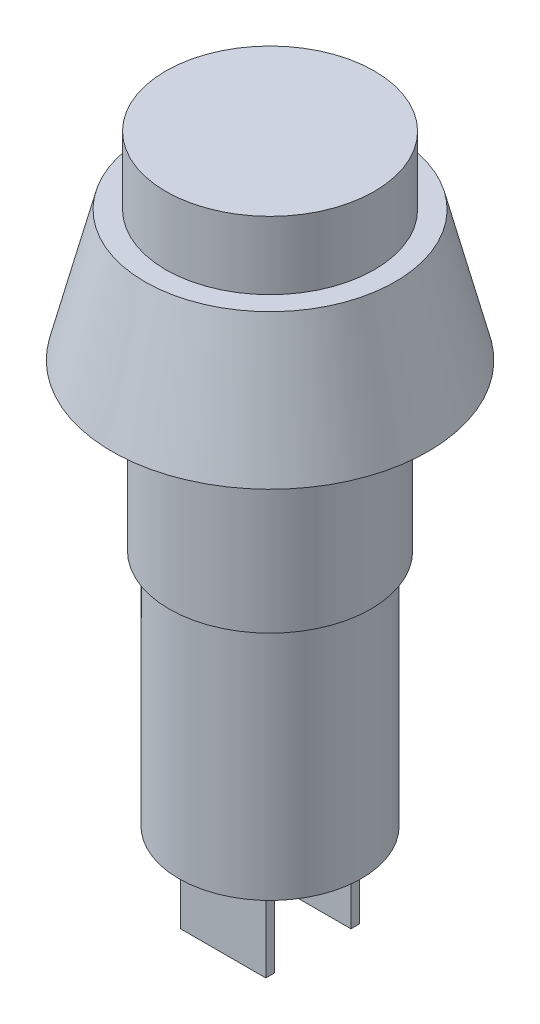
ISO-10303-21;
HEADER;
FILE_DESCRIPTION(('STEP AP214'),'2;1');
FILE_NAME('part.step','',(''),(''),'','','');
FILE_SCHEMA(('AUTOMOTIVE_DESIGN { 1 0 10303 214 1 1 1 1 }'));
ENDSEC;
DATA;
#1=APPLICATION_CONTEXT('core data for automotive mechanical design processes');
#2=APPLICATION_PROTOCOL_DEFINITION('international standard','automotive_design',2000,#1);
#3=PRODUCT_CONTEXT('',#1,'mechanical');
#4=PRODUCT('Part','Part','',(#3));
#5=PRODUCT_RELATED_PRODUCT_CATEGORY('part','',(#4));
#6=PRODUCT_DEFINITION_FORMATION('','',#4);
#7=PRODUCT_DEFINITION_CONTEXT('part definition',#1,'design');
#8=PRODUCT_DEFINITION('design','',#6,#7);
#9=PRODUCT_DEFINITION_SHAPE('','',#8);
#10=(LENGTH_UNIT() NAMED_UNIT(*) SI_UNIT(.MILLI.,.METRE.));
#11=(NAMED_UNIT(*) PLANE_ANGLE_UNIT() SI_UNIT($,.RADIAN.));
#12=(NAMED_UNIT(*) SI_UNIT($,.STERADIAN.) SOLID_ANGLE_UNIT());
#13=UNCERTAINTY_MEASURE_WITH_UNIT(LENGTH_MEASURE(1.E-05),#10,'distance_accuracy_value','');
#14=(GEOMETRIC_REPRESENTATION_CONTEXT(3) GLOBAL_UNCERTAINTY_ASSIGNED_CONTEXT((#13)) GLOBAL_UNIT_ASSIGNED_CONTEXT((#10,
#11,#12)) REPRESENTATION_CONTEXT('',''));
#15=CARTESIAN_POINT('',(0.,0.,0.));
#16=DIRECTION('',(0.,0.,1.));
#17=DIRECTION('',(1.,0.,0.));
#18=AXIS2_PLACEMENT_3D('',#15,#16,#17);
#19=CARTESIAN_POINT('',(0.,-23.2,0.));
#20=DIRECTION('',(0.,-1.,0.));
#21=DIRECTION('',(0.,0.,-1.));
#22=AXIS2_PLACEMENT_3D('',#19,#20,#21);
#23=PLANE('',#22);
#24=CARTESIAN_POINT('',(0.,-23.2,0.));
#25=DIRECTION('',(0.,-1.,0.));
#26=DIRECTION('',(0.,0.,-1.));
#27=AXIS2_PLACEMENT_3D('',#24,#25,#26);
#28=CIRCLE('',#27,5.25);
#29=CARTESIAN_POINT('',(0.,-23.2,5.25));
#30=VERTEX_POINT('',#29);
#31=EDGE_CURVE('E159',#30,#30,#28,.T.);
#32=ORIENTED_EDGE('',*,*,#31,.T.);
#33=EDGE_LOOP('',(#32));
#34=FACE_BOUND('',#33,.T.);
#35=DIRECTION('',(-1.,0.,0.));
#36=VECTOR('',#35,1.);
#37=CARTESIAN_POINT('',(-2.44888346902528,-23.2,-2.2));
#38=LINE('',#37,#36);
#39=CARTESIAN_POINT('',(2.44972941126065,-23.2,-2.2));
#40=VERTEX_POINT('',#39);
#41=CARTESIAN_POINT('',(-2.44888346902528,-23.2,-2.2));
#42=VERTEX_POINT('',#41);
#43=EDGE_CURVE('E130',#40,#42,#38,.T.);
#44=ORIENTED_EDGE('',*,*,#43,.F.);
#45=DIRECTION('',(0.,0.,1.));
#46=VECTOR('',#45,1.);
#47=CARTESIAN_POINT('',(2.44972941126065,-23.2,-2.2));
#48=LINE('',#47,#46);
#49=CARTESIAN_POINT('',(2.44972941126065,-23.2,-2.70037689957547));
#50=VERTEX_POINT('',#49);
#51=EDGE_CURVE('E127',#50,#40,#48,.T.);
#52=ORIENTED_EDGE('',*,*,#51,.F.);
#53=DIRECTION('',(1.,0.,0.));
#54=VECTOR('',#53,1.);
#55=CARTESIAN_POINT('',(-2.44888346902528,-23.2,-2.70037689957547));
#56=LINE('',#55,#54);
#57=CARTESIAN_POINT('',(-2.44888346902528,-23.2,-2.70037689957547));
#58=VERTEX_POINT('',#57);
#59=EDGE_CURVE('E139',#58,#50,#56,.T.);
#60=ORIENTED_EDGE('',*,*,#59,.F.);
#61=DIRECTION('',(0.,0.,-1.));
#62=VECTOR('',#61,1.);
#63=CARTESIAN_POINT('',(-2.44888346902528,-23.2,-2.2));
#64=LINE('',#63,#62);
#65=EDGE_CURVE('E147',#42,#58,#64,.T.);
#66=ORIENTED_EDGE('',*,*,#65,.F.);
#67=EDGE_LOOP('',(#44,#52,#60,#66));
#68=FACE_BOUND('',#67,.T.);
#69=DIRECTION('',(-1.,0.,0.));
#70=VECTOR('',#69,1.);
#71=CARTESIAN_POINT('',(-2.44888346902528,-23.2,2.69560741262609));
#72=LINE('',#71,#70);
#73=CARTESIAN_POINT('',(2.44972941126065,-23.2,2.69560741262609));
#74=VERTEX_POINT('',#73);
#75=CARTESIAN_POINT('',(-2.44888346902528,-23.2,2.69560741262609));
#76=VERTEX_POINT('',#75);
#77=EDGE_CURVE('E373',#74,#76,#72,.T.);
#78=ORIENTED_EDGE('',*,*,#77,.F.);
#79=DIRECTION('',(0.,0.,1.));
#80=VECTOR('',#79,1.);
#81=CARTESIAN_POINT('',(2.44972941126065,-23.2,2.2));
#82=LINE('',#81,#80);
#83=CARTESIAN_POINT('',(2.44972941126065,-23.2,2.2));
#84=VERTEX_POINT('',#83);
#85=EDGE_CURVE('E125',#84,#74,#82,.T.);
#86=ORIENTED_EDGE('',*,*,#85,.F.);
#87=DIRECTION('',(1.,0.,0.));
#88=VECTOR('',#87,1.);
#89=CARTESIAN_POINT('',(-2.44888346902528,-23.2,2.2));
#90=LINE('',#89,#88);
#91=CARTESIAN_POINT('',(-2.44888346902528,-23.2,2.2));
#92=VERTEX_POINT('',#91);
#93=EDGE_CURVE('E121',#92,#84,#90,.T.);
#94=ORIENTED_EDGE('',*,*,#93,.F.);
#95=DIRECTION('',(0.,0.,-1.));
#96=VECTOR('',#95,1.);
#97=CARTESIAN_POINT('',(-2.44888346902528,-23.2,2.2));
#98=LINE('',#97,#96);
#99=EDGE_CURVE('E370',#76,#92,#98,.T.);
#100=ORIENTED_EDGE('',*,*,#99,.F.);
#101=EDGE_LOOP('',(#78,#86,#94,#100));
#102=FACE_BOUND('',#101,.T.);
#103=ADVANCED_FACE('F36',(#34,#68,#102),#23,.T.);
#104=CARTESIAN_POINT('',(-9.1,0.,0.));
#105=DIRECTION('',(0.,1.,0.));
#106=DIRECTION('',(0.,0.,1.));
#107=AXIS2_PLACEMENT_3D('',#104,#105,#106);
#108=PLANE('',#107);
#109=CARTESIAN_POINT('',(0.,0.,0.));
#110=DIRECTION('',(0.,1.,0.));
#111=DIRECTION('',(0.,0.,1.));
#112=AXIS2_PLACEMENT_3D('',#109,#110,#111);
#113=CIRCLE('',#112,5.8);
#114=CARTESIAN_POINT('',(0.,0.,5.8));
#115=VERTEX_POINT('',#114);
#116=EDGE_CURVE('E11',#115,#115,#113,.F.);
#117=ORIENTED_EDGE('',*,*,#116,.F.);
#118=EDGE_LOOP('',(#117));
#119=FACE_BOUND('',#118,.T.);
#120=CARTESIAN_POINT('',(0.,0.,0.));
#121=DIRECTION('',(0.,-1.,0.));
#122=DIRECTION('',(0.,0.,-1.));
#123=AXIS2_PLACEMENT_3D('',#120,#121,#122);
#124=CIRCLE('',#123,9.1);
#125=CARTESIAN_POINT('',(0.,0.,-9.1));
#126=VERTEX_POINT('',#125);
#127=EDGE_CURVE('E170',#126,#126,#124,.T.);
#128=ORIENTED_EDGE('',*,*,#127,.T.);
#129=EDGE_LOOP('',(#128));
#130=FACE_BOUND('',#129,.T.);
#131=ADVANCED_FACE('F38',(#119,#130),#108,.F.);
#132=CARTESIAN_POINT('',(0.,7.5,0.));
#133=DIRECTION('',(0.,-1.,0.));
#134=DIRECTION('',(0.,0.,-1.));
#135=AXIS2_PLACEMENT_3D('',#132,#133,#134);
#136=PLANE('',#135);
#137=CARTESIAN_POINT('',(0.,7.5,0.));
#138=DIRECTION('',(0.,-1.,0.));
#139=DIRECTION('',(0.,0.,-1.));
#140=AXIS2_PLACEMENT_3D('',#137,#138,#139);
#141=CIRCLE('',#140,6.);
#142=CARTESIAN_POINT('',(0.,7.5,-6.));
#143=VERTEX_POINT('',#142);
#144=EDGE_CURVE('E44',#143,#143,#141,.F.);
#145=ORIENTED_EDGE('',*,*,#144,.F.);
#146=EDGE_LOOP('',(#145));
#147=FACE_BOUND('',#146,.T.);
#148=CARTESIAN_POINT('',(0.,7.5,0.));
#149=DIRECTION('',(0.,-1.,0.));
#150=DIRECTION('',(0.,0.,-1.));
#151=AXIS2_PLACEMENT_3D('',#148,#149,#150);
#152=CIRCLE('',#151,7.2);
#153=CARTESIAN_POINT('',(0.,7.5,-7.2));
#154=VERTEX_POINT('',#153);
#155=EDGE_CURVE('E173',#154,#154,#152,.T.);
#156=ORIENTED_EDGE('',*,*,#155,.F.);
#157=EDGE_LOOP('',(#156));
#158=FACE_BOUND('',#157,.T.);
#159=ADVANCED_FACE('F180',(#147,#158),#136,.F.);
#160=CARTESIAN_POINT('',(0.,7.5,0.));
#161=DIRECTION('',(0.,-1.,0.));
#162=DIRECTION('',(0.,0.,-1.));
#163=AXIS2_PLACEMENT_3D('',#160,#161,#162);
#164=CONICAL_SURFACE('',#163,7.2,0.248113449096677);
#165=ORIENTED_EDGE('',*,*,#127,.F.);
#166=EDGE_LOOP('',(#165));
#167=FACE_BOUND('',#166,.T.);
#168=ORIENTED_EDGE('',*,*,#155,.T.);
#169=EDGE_LOOP('',(#168));
#170=FACE_BOUND('',#169,.T.);
#171=ADVANCED_FACE('F183',(#167,#170),#164,.T.);
#172=CARTESIAN_POINT('',(0.,11.4,0.));
#173=DIRECTION('',(0.,-1.,0.));
#174=DIRECTION('',(0.,0.,-1.));
#175=AXIS2_PLACEMENT_3D('',#172,#173,#174);
#176=CYLINDRICAL_SURFACE('',#175,6.);
#177=CARTESIAN_POINT('',(0.,11.4,0.));
#178=DIRECTION('',(0.,1.,0.));
#179=DIRECTION('',(0.,0.,1.));
#180=AXIS2_PLACEMENT_3D('',#177,#178,#179);
#181=CIRCLE('',#180,6.);
#182=CARTESIAN_POINT('',(0.,11.4,6.));
#183=VERTEX_POINT('',#182);
#184=EDGE_CURVE('E167',#183,#183,#181,.T.);
#185=ORIENTED_EDGE('',*,*,#184,.F.);
#186=EDGE_LOOP('',(#185));
#187=FACE_BOUND('',#186,.T.);
#188=ORIENTED_EDGE('',*,*,#144,.T.);
#189=EDGE_LOOP('',(#188));
#190=FACE_BOUND('',#189,.T.);
#191=ADVANCED_FACE('F178',(#187,#190),#176,.T.);
#192=CARTESIAN_POINT('',(0.,11.4,0.));
#193=DIRECTION('',(0.,1.,0.));
#194=DIRECTION('',(0.,0.,1.));
#195=AXIS2_PLACEMENT_3D('',#192,#193,#194);
#196=PLANE('',#195);
#197=ORIENTED_EDGE('',*,*,#184,.T.);
#198=EDGE_LOOP('',(#197));
#199=FACE_BOUND('',#198,.T.);
#200=ADVANCED_FACE('F192',(#199),#196,.T.);
#201=CARTESIAN_POINT('',(0.,-9.5,0.));
#202=DIRECTION('',(0.,1.,0.));
#203=DIRECTION('',(0.,0.,1.));
#204=AXIS2_PLACEMENT_3D('',#201,#202,#203);
#205=CYLINDRICAL_SURFACE('',#204,5.8);
#206=CARTESIAN_POINT('',(0.,-9.5,0.));
#207=DIRECTION('',(0.,-1.,0.));
#208=DIRECTION('',(0.,0.,-1.));
#209=AXIS2_PLACEMENT_3D('',#206,#207,#208);
#210=CIRCLE('',#209,5.8);
#211=CARTESIAN_POINT('',(0.,-9.5,-5.8));
#212=VERTEX_POINT('',#211);
#213=EDGE_CURVE('E162',#212,#212,#210,.T.);
#214=ORIENTED_EDGE('',*,*,#213,.F.);
#215=EDGE_LOOP('',(#214));
#216=FACE_BOUND('',#215,.T.);
#217=ORIENTED_EDGE('',*,*,#116,.T.);
#218=EDGE_LOOP('',(#217));
#219=FACE_BOUND('',#218,.T.);
#220=ADVANCED_FACE('F215',(#216,#219),#205,.T.);
#221=CARTESIAN_POINT('',(0.,-9.5,0.));
#222=DIRECTION('',(0.,-1.,0.));
#223=DIRECTION('',(0.,0.,-1.));
#224=AXIS2_PLACEMENT_3D('',#221,#222,#223);
#225=PLANE('',#224);
#226=CARTESIAN_POINT('',(0.,-9.5,0.));
#227=DIRECTION('',(0.,-1.,0.));
#228=DIRECTION('',(0.,0.,-1.));
#229=AXIS2_PLACEMENT_3D('',#226,#227,#228);
#230=CIRCLE('',#229,5.25);
#231=CARTESIAN_POINT('',(0.,-9.5,5.25));
#232=VERTEX_POINT('',#231);
#233=EDGE_CURVE('E158',#232,#232,#230,.T.);
#234=ORIENTED_EDGE('',*,*,#233,.F.);
#235=EDGE_LOOP('',(#234));
#236=FACE_BOUND('',#235,.T.);
#237=ORIENTED_EDGE('',*,*,#213,.T.);
#238=EDGE_LOOP('',(#237));
#239=FACE_BOUND('',#238,.T.);
#240=ADVANCED_FACE('F211',(#236,#239),#225,.T.);
#241=CARTESIAN_POINT('',(0.,-23.2,0.));
#242=DIRECTION('',(0.,1.,0.));
#243=DIRECTION('',(0.,0.,1.));
#244=AXIS2_PLACEMENT_3D('',#241,#242,#243);
#245=CYLINDRICAL_SURFACE('',#244,5.25);
#246=CARTESIAN_POINT('',(0.,-23.2,5.25));
#247=CARTESIAN_POINT('',(0.,-23.0572916666667,5.25));
#248=CARTESIAN_POINT('',(0.,-22.9145833333333,5.25));
#249=CARTESIAN_POINT('',(0.,-22.6291666666667,5.25));
#250=CARTESIAN_POINT('',(0.,-22.4864583333333,5.25));
#251=CARTESIAN_POINT('',(0.,-22.2010416666667,5.25));
#252=CARTESIAN_POINT('',(0.,-22.0583333333333,5.25));
#253=CARTESIAN_POINT('',(0.,-21.7729166666667,5.25));
#254=CARTESIAN_POINT('',(0.,-21.6302083333333,5.25));
#255=CARTESIAN_POINT('',(0.,-21.3447916666667,5.25));
#256=CARTESIAN_POINT('',(0.,-21.2020833333333,5.25));
#257=CARTESIAN_POINT('',(0.,-20.9166666666667,5.25));
#258=CARTESIAN_POINT('',(0.,-20.7739583333333,5.25));
#259=CARTESIAN_POINT('',(0.,-20.4885416666667,5.25));
#260=CARTESIAN_POINT('',(0.,-20.3458333333333,5.25));
#261=CARTESIAN_POINT('',(0.,-20.0604166666667,5.25));
#262=CARTESIAN_POINT('',(0.,-19.9177083333333,5.25));
#263=CARTESIAN_POINT('',(0.,-19.6322916666667,5.25));
#264=CARTESIAN_POINT('',(0.,-19.4895833333333,5.25));
#265=CARTESIAN_POINT('',(0.,-19.2041666666667,5.25));
#266=CARTESIAN_POINT('',(0.,-19.0614583333333,5.25));
#267=CARTESIAN_POINT('',(0.,-18.7760416666667,5.25));
#268=CARTESIAN_POINT('',(0.,-18.6333333333333,5.25));
#269=CARTESIAN_POINT('',(0.,-18.3479166666667,5.25));
#270=CARTESIAN_POINT('',(0.,-18.2052083333333,5.25));
#271=CARTESIAN_POINT('',(0.,-17.9197916666667,5.25));
#272=CARTESIAN_POINT('',(0.,-17.7770833333333,5.25));
#273=CARTESIAN_POINT('',(0.,-17.4916666666667,5.25));
#274=CARTESIAN_POINT('',(0.,-17.3489583333333,5.25));
#275=CARTESIAN_POINT('',(0.,-17.0635416666667,5.25));
#276=CARTESIAN_POINT('',(0.,-16.9208333333333,5.25));
#277=CARTESIAN_POINT('',(0.,-16.6354166666667,5.25));
#278=CARTESIAN_POINT('',(0.,-16.4927083333333,5.25));
#279=CARTESIAN_POINT('',(0.,-16.2072916666667,5.25));
#280=CARTESIAN_POINT('',(0.,-16.0645833333333,5.25));
#281=CARTESIAN_POINT('',(0.,-15.7791666666667,5.25));
#282=CARTESIAN_POINT('',(0.,-15.6364583333333,5.25));
#283=CARTESIAN_POINT('',(0.,-15.3510416666667,5.25));
#284=CARTESIAN_POINT('',(0.,-15.2083333333333,5.25));
#285=CARTESIAN_POINT('',(0.,-14.9229166666667,5.25));
#286=CARTESIAN_POINT('',(0.,-14.7802083333333,5.25));
#287=CARTESIAN_POINT('',(0.,-14.4947916666667,5.25));
#288=CARTESIAN_POINT('',(0.,-14.3520833333333,5.25));
#289=CARTESIAN_POINT('',(0.,-14.0666666666667,5.25));
#290=CARTESIAN_POINT('',(0.,-13.9239583333333,5.25));
#291=CARTESIAN_POINT('',(0.,-13.6385416666667,5.25));
#292=CARTESIAN_POINT('',(0.,-13.4958333333333,5.25));
#293=CARTESIAN_POINT('',(0.,-13.2104166666667,5.25));
#294=CARTESIAN_POINT('',(0.,-13.0677083333333,5.25));
#295=CARTESIAN_POINT('',(0.,-12.7822916666667,5.25));
#296=CARTESIAN_POINT('',(0.,-12.6395833333333,5.25));
#297=CARTESIAN_POINT('',(0.,-12.3541666666667,5.25));
#298=CARTESIAN_POINT('',(0.,-12.2114583333333,5.25));
#299=CARTESIAN_POINT('',(0.,-11.9260416666667,5.25));
#300=CARTESIAN_POINT('',(0.,-11.7833333333333,5.25));
#301=CARTESIAN_POINT('',(0.,-11.4979166666667,5.25));
#302=CARTESIAN_POINT('',(0.,-11.3552083333333,5.25));
#303=CARTESIAN_POINT('',(0.,-11.0697916666667,5.25));
#304=CARTESIAN_POINT('',(0.,-10.9270833333333,5.25));
#305=CARTESIAN_POINT('',(0.,-10.6416666666667,5.25));
#306=CARTESIAN_POINT('',(0.,-10.4989583333333,5.25));
#307=CARTESIAN_POINT('',(0.,-10.2135416666667,5.25));
#308=CARTESIAN_POINT('',(0.,-10.0708333333333,5.25));
#309=CARTESIAN_POINT('',(0.,-9.78541666666667,5.25));
#310=CARTESIAN_POINT('',(0.,-9.64270833333333,5.25));
#311=CARTESIAN_POINT('',(0.,-9.5,5.25));
#312=B_SPLINE_CURVE_WITH_KNOTS('',3,(#246,#247,#248,#249,#250,#251,#252,#253,#254,#255,#256,
#257,#258,#259,#260,#261,#262,#263,#264,#265,#266,#267,#268,#269,#270,#271,#272,#273,#274,#275,
#276,#277,#278,#279,#280,#281,#282,#283,#284,#285,#286,#287,#288,#289,#290,#291,#292,#293,#294,
#295,#296,#297,#298,#299,#300,#301,#302,#303,#304,#305,#306,#307,#308,#309,#310,#311),
.UNSPECIFIED.,.F.,.F.,(4,2,2,2,2,2,2,2,2,2,2,2,2,2,2,2,2,2,2,2,2,2,2,2,2,2,2,2,2,2,2,2,4),(0.,
0.428124999999998,0.856249999999999,1.284375,1.7125,2.140625,2.56875,2.996875,3.425,3.853125,
4.28125,4.709375,5.1375,5.565625,5.99375,6.421875,6.85,7.278125,7.70625,8.134375,
8.56249999999999,8.99062499999999,9.41874999999999,9.846875,10.275,10.703125,11.13125,11.559375,
11.9875,12.415625,12.84375,13.271875,13.7),.UNSPECIFIED.);
#313=EDGE_CURVE('BSEAM208',#30,#232,#312,.T.);
#314=ORIENTED_EDGE('',*,*,#31,.F.);
#315=ORIENTED_EDGE('',*,*,#233,.T.);
#316=ORIENTED_EDGE('',*,*,#313,.T.);
#317=ORIENTED_EDGE('',*,*,#313,.F.);
#318=EDGE_LOOP('',(#314,#316,#315,#317));
#319=FACE_BOUND('',#318,.T.);
#320=ADVANCED_FACE('F208',(#319),#245,.T.);
#321=CARTESIAN_POINT('',(2.44972941126065,-28.2,-2.2));
#322=DIRECTION('',(-1.,0.,0.));
#323=DIRECTION('',(0.,0.,1.));
#324=AXIS2_PLACEMENT_3D('',#321,#322,#323);
#325=PLANE('',#324);
#326=ORIENTED_EDGE('',*,*,#51,.T.);
#327=DIRECTION('',(0.,1.,0.));
#328=VECTOR('',#327,1.);
#329=CARTESIAN_POINT('',(2.44972941126065,-28.2,-2.2));
#330=LINE('',#329,#328);
#331=CARTESIAN_POINT('',(2.44972941126065,-28.2,-2.2));
#332=VERTEX_POINT('',#331);
#333=EDGE_CURVE('E156',#332,#40,#330,.T.);
#334=ORIENTED_EDGE('',*,*,#333,.F.);
#335=DIRECTION('',(0.,0.,1.));
#336=VECTOR('',#335,1.);
#337=CARTESIAN_POINT('',(2.44972941126065,-28.2,-2.2));
#338=LINE('',#337,#336);
#339=CARTESIAN_POINT('',(2.44972941126065,-28.2,-2.70037689957547));
#340=VERTEX_POINT('',#339);
#341=EDGE_CURVE('E135',#340,#332,#338,.T.);
#342=ORIENTED_EDGE('',*,*,#341,.F.);
#343=DIRECTION('',(0.,1.,0.));
#344=VECTOR('',#343,1.);
#345=CARTESIAN_POINT('',(2.44972941126065,-28.2,-2.70037689957547));
#346=LINE('',#345,#344);
#347=EDGE_CURVE('E144',#340,#50,#346,.T.);
#348=ORIENTED_EDGE('',*,*,#347,.T.);
#349=EDGE_LOOP('',(#326,#334,#342,#348));
#350=FACE_BOUND('',#349,.T.);
#351=ADVANCED_FACE('F206',(#350),#325,.F.);
#352=CARTESIAN_POINT('',(-2.44888346902528,-28.2,-2.2));
#353=DIRECTION('',(0.,0.,-1.));
#354=DIRECTION('',(-1.,0.,0.));
#355=AXIS2_PLACEMENT_3D('',#352,#353,#354);
#356=PLANE('',#355);
#357=ORIENTED_EDGE('',*,*,#43,.T.);
#358=DIRECTION('',(0.,1.,0.));
#359=VECTOR('',#358,1.);
#360=CARTESIAN_POINT('',(-2.44888346902528,-28.2,-2.2));
#361=LINE('',#360,#359);
#362=CARTESIAN_POINT('',(-2.44888346902528,-28.2,-2.2));
#363=VERTEX_POINT('',#362);
#364=EDGE_CURVE('E153',#363,#42,#361,.T.);
#365=ORIENTED_EDGE('',*,*,#364,.F.);
#366=DIRECTION('',(-1.,0.,0.));
#367=VECTOR('',#366,1.);
#368=CARTESIAN_POINT('',(-2.44888346902528,-28.2,-2.2));
#369=LINE('',#368,#367);
#370=EDGE_CURVE('E138',#332,#363,#369,.T.);
#371=ORIENTED_EDGE('',*,*,#370,.F.);
#372=ORIENTED_EDGE('',*,*,#333,.T.);
#373=EDGE_LOOP('',(#357,#365,#371,#372));
#374=FACE_BOUND('',#373,.T.);
#375=ADVANCED_FACE('F246',(#374),#356,.F.);
#376=CARTESIAN_POINT('',(-2.44888346902528,-28.2,-2.2));
#377=DIRECTION('',(1.,0.,0.));
#378=DIRECTION('',(0.,0.,-1.));
#379=AXIS2_PLACEMENT_3D('',#376,#377,#378);
#380=PLANE('',#379);
#381=ORIENTED_EDGE('',*,*,#65,.T.);
#382=DIRECTION('',(0.,1.,0.));
#383=VECTOR('',#382,1.);
#384=CARTESIAN_POINT('',(-2.44888346902528,-28.2,-2.70037689957547));
#385=LINE('',#384,#383);
#386=CARTESIAN_POINT('',(-2.44888346902528,-28.2,-2.70037689957547));
#387=VERTEX_POINT('',#386);
#388=EDGE_CURVE('E59',#387,#58,#385,.T.);
#389=ORIENTED_EDGE('',*,*,#388,.F.);
#390=DIRECTION('',(0.,0.,-1.));
#391=VECTOR('',#390,1.);
#392=CARTESIAN_POINT('',(-2.44888346902528,-28.2,-2.2));
#393=LINE('',#392,#391);
#394=EDGE_CURVE('E141',#363,#387,#393,.T.);
#395=ORIENTED_EDGE('',*,*,#394,.F.);
#396=ORIENTED_EDGE('',*,*,#364,.T.);
#397=EDGE_LOOP('',(#381,#389,#395,#396));
#398=FACE_BOUND('',#397,.T.);
#399=ADVANCED_FACE('F253',(#398),#380,.F.);
#400=CARTESIAN_POINT('',(-2.44888346902528,-28.2,-2.70037689957547));
#401=DIRECTION('',(0.,0.,1.));
#402=DIRECTION('',(1.,0.,0.));
#403=AXIS2_PLACEMENT_3D('',#400,#401,#402);
#404=PLANE('',#403);
#405=ORIENTED_EDGE('',*,*,#59,.T.);
#406=ORIENTED_EDGE('',*,*,#347,.F.);
#407=DIRECTION('',(1.,0.,0.));
#408=VECTOR('',#407,1.);
#409=CARTESIAN_POINT('',(-2.44888346902528,-28.2,-2.70037689957547));
#410=LINE('',#409,#408);
#411=EDGE_CURVE('E143',#387,#340,#410,.T.);
#412=ORIENTED_EDGE('',*,*,#411,.F.);
#413=ORIENTED_EDGE('',*,*,#388,.T.);
#414=EDGE_LOOP('',(#405,#406,#412,#413));
#415=FACE_BOUND('',#414,.T.);
#416=ADVANCED_FACE('F260',(#415),#404,.F.);
#417=CARTESIAN_POINT('',(0.,-28.2,0.));
#418=DIRECTION('',(0.,-1.,0.));
#419=DIRECTION('',(0.,0.,-1.));
#420=AXIS2_PLACEMENT_3D('',#417,#418,#419);
#421=PLANE('',#420);
#422=ORIENTED_EDGE('',*,*,#341,.T.);
#423=ORIENTED_EDGE('',*,*,#370,.T.);
#424=ORIENTED_EDGE('',*,*,#394,.T.);
#425=ORIENTED_EDGE('',*,*,#411,.T.);
#426=EDGE_LOOP('',(#422,#423,#424,#425));
#427=FACE_BOUND('',#426,.T.);
#428=ADVANCED_FACE('F268',(#427),#421,.T.);
#429=CARTESIAN_POINT('',(2.44972941126065,-28.2,2.2));
#430=DIRECTION('',(-1.,0.,0.));
#431=DIRECTION('',(0.,0.,1.));
#432=AXIS2_PLACEMENT_3D('',#429,#430,#431);
#433=PLANE('',#432);
#434=ORIENTED_EDGE('',*,*,#85,.T.);
#435=DIRECTION('',(0.,1.,0.));
#436=VECTOR('',#435,1.);
#437=CARTESIAN_POINT('',(2.44972941126065,-28.2,2.69560741262609));
#438=LINE('',#437,#436);
#439=CARTESIAN_POINT('',(2.44972941126065,-28.2,2.69560741262609));
#440=VERTEX_POINT('',#439);
#441=EDGE_CURVE('E106',#440,#74,#438,.T.);
#442=ORIENTED_EDGE('',*,*,#441,.F.);
#443=DIRECTION('',(0.,0.,1.));
#444=VECTOR('',#443,1.);
#445=CARTESIAN_POINT('',(2.44972941126065,-28.2,2.2));
#446=LINE('',#445,#444);
#447=CARTESIAN_POINT('',(2.44972941126065,-28.2,2.2));
#448=VERTEX_POINT('',#447);
#449=EDGE_CURVE('E113',#448,#440,#446,.T.);
#450=ORIENTED_EDGE('',*,*,#449,.F.);
#451=DIRECTION('',(0.,1.,0.));
#452=VECTOR('',#451,1.);
#453=CARTESIAN_POINT('',(2.44972941126065,-28.2,2.2));
#454=LINE('',#453,#452);
#455=EDGE_CURVE('E367',#448,#84,#454,.T.);
#456=ORIENTED_EDGE('',*,*,#455,.T.);
#457=EDGE_LOOP('',(#434,#442,#450,#456));
#458=FACE_BOUND('',#457,.T.);
#459=ADVANCED_FACE('F123',(#458),#433,.F.);
#460=CARTESIAN_POINT('',(-2.44888346902528,-28.2,2.69560741262609));
#461=DIRECTION('',(0.,0.,-1.));
#462=DIRECTION('',(-1.,0.,0.));
#463=AXIS2_PLACEMENT_3D('',#460,#461,#462);
#464=PLANE('',#463);
#465=ORIENTED_EDGE('',*,*,#77,.T.);
#466=DIRECTION('',(0.,1.,0.));
#467=VECTOR('',#466,1.);
#468=CARTESIAN_POINT('',(-2.44888346902528,-28.2,2.69560741262609));
#469=LINE('',#468,#467);
#470=CARTESIAN_POINT('',(-2.44888346902528,-28.2,2.69560741262609));
#471=VERTEX_POINT('',#470);
#472=EDGE_CURVE('E109',#471,#76,#469,.T.);
#473=ORIENTED_EDGE('',*,*,#472,.F.);
#474=DIRECTION('',(-1.,0.,0.));
#475=VECTOR('',#474,1.);
#476=CARTESIAN_POINT('',(-2.44888346902528,-28.2,2.69560741262609));
#477=LINE('',#476,#475);
#478=EDGE_CURVE('E102',#440,#471,#477,.T.);
#479=ORIENTED_EDGE('',*,*,#478,.F.);
#480=ORIENTED_EDGE('',*,*,#441,.T.);
#481=EDGE_LOOP('',(#465,#473,#479,#480));
#482=FACE_BOUND('',#481,.T.);
#483=ADVANCED_FACE('F104',(#482),#464,.F.);
#484=CARTESIAN_POINT('',(-2.44888346902528,-28.2,2.2));
#485=DIRECTION('',(1.,0.,0.));
#486=DIRECTION('',(0.,0.,-1.));
#487=AXIS2_PLACEMENT_3D('',#484,#485,#486);
#488=PLANE('',#487);
#489=ORIENTED_EDGE('',*,*,#99,.T.);
#490=DIRECTION('',(0.,1.,0.));
#491=VECTOR('',#490,1.);
#492=CARTESIAN_POINT('',(-2.44888346902528,-28.2,2.2));
#493=LINE('',#492,#491);
#494=CARTESIAN_POINT('',(-2.44888346902528,-28.2,2.2));
#495=VERTEX_POINT('',#494);
#496=EDGE_CURVE('E51',#495,#92,#493,.T.);
#497=ORIENTED_EDGE('',*,*,#496,.F.);
#498=DIRECTION('',(0.,0.,-1.));
#499=VECTOR('',#498,1.);
#500=CARTESIAN_POINT('',(-2.44888346902528,-28.2,2.2));
#501=LINE('',#500,#499);
#502=EDGE_CURVE('E112',#471,#495,#501,.T.);
#503=ORIENTED_EDGE('',*,*,#502,.F.);
#504=ORIENTED_EDGE('',*,*,#472,.T.);
#505=EDGE_LOOP('',(#489,#497,#503,#504));
#506=FACE_BOUND('',#505,.T.);
#507=ADVANCED_FACE('F288',(#506),#488,.F.);
#508=CARTESIAN_POINT('',(-2.44888346902528,-28.2,2.2));
#509=DIRECTION('',(0.,0.,1.));
#510=DIRECTION('',(1.,0.,0.));
#511=AXIS2_PLACEMENT_3D('',#508,#509,#510);
#512=PLANE('',#511);
#513=ORIENTED_EDGE('',*,*,#93,.T.);
#514=ORIENTED_EDGE('',*,*,#455,.F.);
#515=DIRECTION('',(1.,0.,0.));
#516=VECTOR('',#515,1.);
#517=CARTESIAN_POINT('',(-2.44888346902528,-28.2,2.2));
#518=LINE('',#517,#516);
#519=EDGE_CURVE('E117',#495,#448,#518,.T.);
#520=ORIENTED_EDGE('',*,*,#519,.F.);
#521=ORIENTED_EDGE('',*,*,#496,.T.);
#522=EDGE_LOOP('',(#513,#514,#520,#521));
#523=FACE_BOUND('',#522,.T.);
#524=ADVANCED_FACE('F295',(#523),#512,.F.);
#525=CARTESIAN_POINT('',(0.,-28.2,0.));
#526=DIRECTION('',(0.,1.,0.));
#527=DIRECTION('',(0.,0.,1.));
#528=AXIS2_PLACEMENT_3D('',#525,#526,#527);
#529=PLANE('',#528);
#530=ORIENTED_EDGE('',*,*,#449,.T.);
#531=ORIENTED_EDGE('',*,*,#478,.T.);
#532=ORIENTED_EDGE('',*,*,#502,.T.);
#533=ORIENTED_EDGE('',*,*,#519,.T.);
#534=EDGE_LOOP('',(#530,#531,#532,#533));
#535=FACE_BOUND('',#534,.T.);
#536=ADVANCED_FACE('F116',(#535),#529,.F.);
#537=CLOSED_SHELL('',(#103,#131,#159,#171,#191,#200,#220,#240,#320,#351,#375,#399,#416,#428,
#459,#483,#507,#524,#536));
#538=MANIFOLD_SOLID_BREP('B2',#537);
#539=ADVANCED_BREP_SHAPE_REPRESENTATION('',(#18,#538),#14);
#540=SHAPE_DEFINITION_REPRESENTATION(#9,#539);
ENDSEC;
END-ISO-10303-21;
